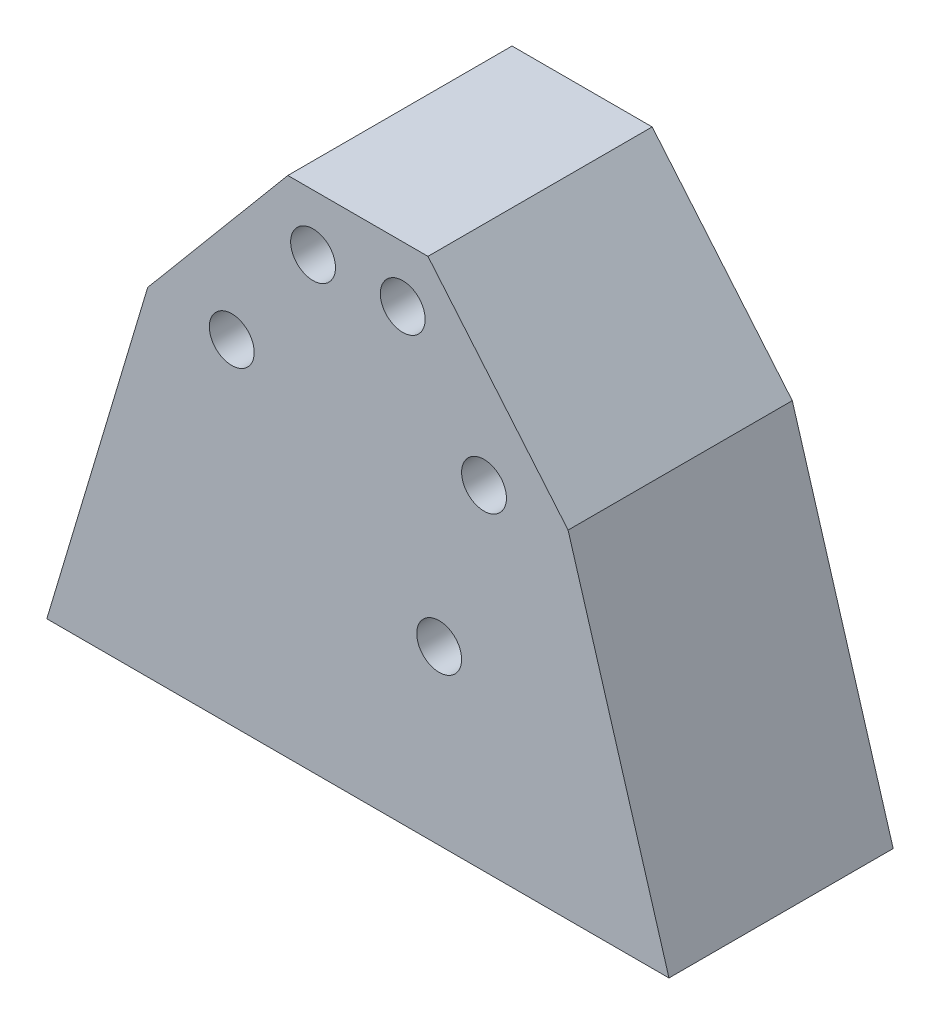
ISO-10303-21;
HEADER;
FILE_DESCRIPTION(('STEP AP214'),'2;1');
FILE_NAME('part.step','',(''),(''),'','','');
FILE_SCHEMA(('AUTOMOTIVE_DESIGN { 1 0 10303 214 1 1 1 1 }'));
ENDSEC;
DATA;
#1=APPLICATION_CONTEXT('core data for automotive mechanical design processes');
#2=APPLICATION_PROTOCOL_DEFINITION('international standard','automotive_design',2000,#1);
#3=PRODUCT_CONTEXT('',#1,'mechanical');
#4=PRODUCT('Part','Part','',(#3));
#5=PRODUCT_RELATED_PRODUCT_CATEGORY('part','',(#4));
#6=PRODUCT_DEFINITION_FORMATION('','',#4);
#7=PRODUCT_DEFINITION_CONTEXT('part definition',#1,'design');
#8=PRODUCT_DEFINITION('design','',#6,#7);
#9=PRODUCT_DEFINITION_SHAPE('','',#8);
#10=(LENGTH_UNIT() NAMED_UNIT(*) SI_UNIT(.MILLI.,.METRE.));
#11=(NAMED_UNIT(*) PLANE_ANGLE_UNIT() SI_UNIT($,.RADIAN.));
#12=(NAMED_UNIT(*) SI_UNIT($,.STERADIAN.) SOLID_ANGLE_UNIT());
#13=UNCERTAINTY_MEASURE_WITH_UNIT(LENGTH_MEASURE(1.E-05),#10,'distance_accuracy_value','');
#14=(GEOMETRIC_REPRESENTATION_CONTEXT(3) GLOBAL_UNCERTAINTY_ASSIGNED_CONTEXT((#13)) GLOBAL_UNIT_ASSIGNED_CONTEXT((#10,
#11,#12)) REPRESENTATION_CONTEXT('',''));
#15=CARTESIAN_POINT('',(0.,0.,0.));
#16=DIRECTION('',(0.,0.,1.));
#17=DIRECTION('',(1.,0.,0.));
#18=AXIS2_PLACEMENT_3D('',#15,#16,#17);
#19=CARTESIAN_POINT('',(0.,45.,40.));
#20=DIRECTION('',(0.,-1.,0.));
#21=DIRECTION('',(0.,0.,-1.));
#22=AXIS2_PLACEMENT_3D('',#19,#20,#21);
#23=PLANE('',#22);
#24=DIRECTION('',(-1.,0.,0.));
#25=VECTOR('',#24,1.);
#26=CARTESIAN_POINT('',(0.,45.,0.));
#27=LINE('',#26,#25);
#28=CARTESIAN_POINT('',(12.5,45.,0.));
#29=VERTEX_POINT('',#28);
#30=CARTESIAN_POINT('',(-12.5,45.,0.));
#31=VERTEX_POINT('',#30);
#32=EDGE_CURVE('E244',#29,#31,#27,.T.);
#33=ORIENTED_EDGE('',*,*,#32,.T.);
#34=DIRECTION('',(0.,0.,-1.));
#35=VECTOR('',#34,1.);
#36=CARTESIAN_POINT('',(-12.5,45.,40.));
#37=LINE('',#36,#35);
#38=CARTESIAN_POINT('',(-12.5,45.,40.));
#39=VERTEX_POINT('',#38);
#40=EDGE_CURVE('E11',#39,#31,#37,.T.);
#41=ORIENTED_EDGE('',*,*,#40,.F.);
#42=DIRECTION('',(-1.,0.,0.));
#43=VECTOR('',#42,1.);
#44=CARTESIAN_POINT('',(0.,45.,40.));
#45=LINE('',#44,#43);
#46=CARTESIAN_POINT('',(12.5,45.,40.));
#47=VERTEX_POINT('',#46);
#48=EDGE_CURVE('E89',#47,#39,#45,.T.);
#49=ORIENTED_EDGE('',*,*,#48,.F.);
#50=DIRECTION('',(0.,0.,-1.));
#51=VECTOR('',#50,1.);
#52=CARTESIAN_POINT('',(12.5,45.,40.));
#53=LINE('',#52,#51);
#54=EDGE_CURVE('E238',#47,#29,#53,.T.);
#55=ORIENTED_EDGE('',*,*,#54,.T.);
#56=EDGE_LOOP('',(#33,#41,#49,#55));
#57=FACE_BOUND('',#56,.T.);
#58=ADVANCED_FACE('F43',(#57),#23,.F.);
#59=CARTESIAN_POINT('',(-29.493475553193,24.7479644588203,40.));
#60=DIRECTION('',(-0.766044443118979,0.642787609686538,0.));
#61=DIRECTION('',(-0.642787609686538,-0.766044443118979,0.));
#62=AXIS2_PLACEMENT_3D('',#59,#60,#61);
#63=PLANE('',#62);
#64=DIRECTION('',(0.642787609686538,0.766044443118979,0.));
#65=VECTOR('',#64,1.);
#66=CARTESIAN_POINT('',(-29.493475553193,24.7479644588203,0.));
#67=LINE('',#66,#65);
#68=CARTESIAN_POINT('',(-37.5,15.2061601851447,0.));
#69=VERTEX_POINT('',#68);
#70=EDGE_CURVE('E139',#69,#31,#67,.T.);
#71=ORIENTED_EDGE('',*,*,#70,.F.);
#72=DIRECTION('',(0.,0.,-1.));
#73=VECTOR('',#72,1.);
#74=CARTESIAN_POINT('',(-37.5,15.2061601851447,40.));
#75=LINE('',#74,#73);
#76=CARTESIAN_POINT('',(-37.5,15.2061601851447,40.));
#77=VERTEX_POINT('',#76);
#78=EDGE_CURVE('E52',#77,#69,#75,.T.);
#79=ORIENTED_EDGE('',*,*,#78,.F.);
#80=DIRECTION('',(0.642787609686538,0.766044443118979,0.));
#81=VECTOR('',#80,1.);
#82=CARTESIAN_POINT('',(-29.493475553193,24.7479644588203,40.));
#83=LINE('',#82,#81);
#84=EDGE_CURVE('E226',#77,#39,#83,.T.);
#85=ORIENTED_EDGE('',*,*,#84,.T.);
#86=ORIENTED_EDGE('',*,*,#40,.T.);
#87=EDGE_LOOP('',(#71,#79,#85,#86));
#88=FACE_BOUND('',#87,.T.);
#89=ADVANCED_FACE('F263',(#88),#63,.T.);
#90=CARTESIAN_POINT('',(0.,-45.,40.));
#91=DIRECTION('',(0.,-1.,0.));
#92=DIRECTION('',(1.,0.,0.));
#93=AXIS2_PLACEMENT_3D('',#90,#91,#92);
#94=PLANE('',#93);
#95=CARTESIAN_POINT('',(-30.,-45.,7.15));
#96=DIRECTION('',(0.,-1.,0.));
#97=DIRECTION('',(1.,0.,0.));
#98=AXIS2_PLACEMENT_3D('',#95,#96,#97);
#99=CIRCLE('',#98,1.75000000000001);
#100=CARTESIAN_POINT('',(-28.25,-45.,7.15));
#101=VERTEX_POINT('',#100);
#102=EDGE_CURVE('E203',#101,#101,#99,.T.);
#103=ORIENTED_EDGE('',*,*,#102,.F.);
#104=EDGE_LOOP('',(#103));
#105=FACE_BOUND('',#104,.T.);
#106=CARTESIAN_POINT('',(-30.,-45.,32.85));
#107=DIRECTION('',(0.,-1.,0.));
#108=DIRECTION('',(-1.,0.,0.));
#109=AXIS2_PLACEMENT_3D('',#106,#107,#108);
#110=CIRCLE('',#109,1.75000000000001);
#111=CARTESIAN_POINT('',(-31.75,-45.,32.85));
#112=VERTEX_POINT('',#111);
#113=EDGE_CURVE('E197',#112,#112,#110,.T.);
#114=ORIENTED_EDGE('',*,*,#113,.F.);
#115=EDGE_LOOP('',(#114));
#116=FACE_BOUND('',#115,.T.);
#117=CARTESIAN_POINT('',(30.,-45.,32.85));
#118=DIRECTION('',(0.,-1.,0.));
#119=DIRECTION('',(1.,0.,0.));
#120=AXIS2_PLACEMENT_3D('',#117,#118,#119);
#121=CIRCLE('',#120,1.75000000000001);
#122=CARTESIAN_POINT('',(31.75,-45.,32.85));
#123=VERTEX_POINT('',#122);
#124=EDGE_CURVE('E190',#123,#123,#121,.T.);
#125=ORIENTED_EDGE('',*,*,#124,.F.);
#126=EDGE_LOOP('',(#125));
#127=FACE_BOUND('',#126,.T.);
#128=CARTESIAN_POINT('',(30.,-45.,7.14999999999997));
#129=DIRECTION('',(0.,-1.,0.));
#130=DIRECTION('',(-1.,0.,0.));
#131=AXIS2_PLACEMENT_3D('',#128,#129,#130);
#132=CIRCLE('',#131,1.75000000000001);
#133=CARTESIAN_POINT('',(28.25,-45.,7.14999999999997));
#134=VERTEX_POINT('',#133);
#135=EDGE_CURVE('E193',#134,#134,#132,.T.);
#136=ORIENTED_EDGE('',*,*,#135,.F.);
#137=EDGE_LOOP('',(#136));
#138=FACE_BOUND('',#137,.T.);
#139=DIRECTION('',(-1.,0.,0.));
#140=VECTOR('',#139,1.);
#141=CARTESIAN_POINT('',(0.,-45.,0.));
#142=LINE('',#141,#140);
#143=CARTESIAN_POINT('',(55.5,-45.,0.));
#144=VERTEX_POINT('',#143);
#145=CARTESIAN_POINT('',(-55.5,-45.,0.));
#146=VERTEX_POINT('',#145);
#147=EDGE_CURVE('E128',#144,#146,#142,.T.);
#148=ORIENTED_EDGE('',*,*,#147,.F.);
#149=DIRECTION('',(0.,0.,1.));
#150=VECTOR('',#149,1.);
#151=CARTESIAN_POINT('',(55.5,-45.,-62.8393326208936));
#152=LINE('',#151,#150);
#153=CARTESIAN_POINT('',(55.5,-45.,40.));
#154=VERTEX_POINT('',#153);
#155=EDGE_CURVE('E132',#144,#154,#152,.T.);
#156=ORIENTED_EDGE('',*,*,#155,.T.);
#157=DIRECTION('',(-1.,0.,0.));
#158=VECTOR('',#157,1.);
#159=CARTESIAN_POINT('',(0.,-45.,40.));
#160=LINE('',#159,#158);
#161=CARTESIAN_POINT('',(-55.5,-45.,40.));
#162=VERTEX_POINT('',#161);
#163=EDGE_CURVE('E229',#154,#162,#160,.T.);
#164=ORIENTED_EDGE('',*,*,#163,.T.);
#165=DIRECTION('',(0.,0.,1.));
#166=VECTOR('',#165,1.);
#167=CARTESIAN_POINT('',(-55.5,-45.,-62.8393326208936));
#168=LINE('',#167,#166);
#169=EDGE_CURVE('E135',#146,#162,#168,.T.);
#170=ORIENTED_EDGE('',*,*,#169,.F.);
#171=EDGE_LOOP('',(#148,#156,#164,#170));
#172=FACE_BOUND('',#171,.T.);
#173=ADVANCED_FACE('F130',(#105,#116,#127,#138,#172),#94,.T.);
#174=CARTESIAN_POINT('',(-22.5,14.6345881455837,40.));
#175=DIRECTION('',(0.,0.,-1.));
#176=DIRECTION('',(-1.,0.,0.));
#177=AXIS2_PLACEMENT_3D('',#174,#175,#176);
#178=CYLINDRICAL_SURFACE('',#177,4.);
#179=CARTESIAN_POINT('',(-22.5,14.6345881455837,40.));
#180=DIRECTION('',(0.,0.,1.));
#181=DIRECTION('',(1.,0.,0.));
#182=AXIS2_PLACEMENT_3D('',#179,#180,#181);
#183=CIRCLE('',#182,4.);
#184=CARTESIAN_POINT('',(-18.5,14.6345881455837,40.));
#185=VERTEX_POINT('',#184);
#186=EDGE_CURVE('E232',#185,#185,#183,.T.);
#187=ORIENTED_EDGE('',*,*,#186,.T.);
#188=EDGE_LOOP('',(#187));
#189=FACE_BOUND('',#188,.T.);
#190=CARTESIAN_POINT('',(-22.5,14.6345881455837,0.));
#191=DIRECTION('',(0.,0.,1.));
#192=DIRECTION('',(1.,0.,0.));
#193=AXIS2_PLACEMENT_3D('',#190,#191,#192);
#194=CIRCLE('',#193,4.);
#195=CARTESIAN_POINT('',(-18.5,14.6345881455837,0.));
#196=VERTEX_POINT('',#195);
#197=EDGE_CURVE('E250',#196,#196,#194,.T.);
#198=ORIENTED_EDGE('',*,*,#197,.F.);
#199=EDGE_LOOP('',(#198));
#200=FACE_BOUND('',#199,.T.);
#201=ADVANCED_FACE('F386',(#189,#200),#178,.F.);
#202=CARTESIAN_POINT('',(29.493475553193,24.7479644588203,40.));
#203=DIRECTION('',(-0.766044443118979,-0.642787609686538,0.));
#204=DIRECTION('',(0.642787609686538,-0.766044443118979,0.));
#205=AXIS2_PLACEMENT_3D('',#202,#203,#204);
#206=PLANE('',#205);
#207=DIRECTION('',(-0.642787609686538,0.766044443118979,0.));
#208=VECTOR('',#207,1.);
#209=CARTESIAN_POINT('',(29.493475553193,24.7479644588203,0.));
#210=LINE('',#209,#208);
#211=CARTESIAN_POINT('',(37.5,15.2061601851447,0.));
#212=VERTEX_POINT('',#211);
#213=EDGE_CURVE('E84',#212,#29,#210,.T.);
#214=ORIENTED_EDGE('',*,*,#213,.T.);
#215=ORIENTED_EDGE('',*,*,#54,.F.);
#216=DIRECTION('',(-0.642787609686538,0.766044443118979,0.));
#217=VECTOR('',#216,1.);
#218=CARTESIAN_POINT('',(29.493475553193,24.7479644588203,40.));
#219=LINE('',#218,#217);
#220=CARTESIAN_POINT('',(37.5,15.2061601851447,40.));
#221=VERTEX_POINT('',#220);
#222=EDGE_CURVE('E68',#221,#47,#219,.T.);
#223=ORIENTED_EDGE('',*,*,#222,.F.);
#224=DIRECTION('',(0.,0.,-1.));
#225=VECTOR('',#224,1.);
#226=CARTESIAN_POINT('',(37.5,15.2061601851447,40.));
#227=LINE('',#226,#225);
#228=EDGE_CURVE('E256',#221,#212,#227,.T.);
#229=ORIENTED_EDGE('',*,*,#228,.T.);
#230=EDGE_LOOP('',(#214,#215,#223,#229));
#231=FACE_BOUND('',#230,.T.);
#232=ADVANCED_FACE('F305',(#231),#206,.F.);
#233=CARTESIAN_POINT('',(22.5,14.6345881455837,40.));
#234=DIRECTION('',(0.,0.,-1.));
#235=DIRECTION('',(-1.,0.,0.));
#236=AXIS2_PLACEMENT_3D('',#233,#234,#235);
#237=CYLINDRICAL_SURFACE('',#236,4.);
#238=CARTESIAN_POINT('',(22.5,14.6345881455837,40.));
#239=DIRECTION('',(0.,0.,1.));
#240=DIRECTION('',(1.,0.,0.));
#241=AXIS2_PLACEMENT_3D('',#238,#239,#240);
#242=CIRCLE('',#241,4.);
#243=CARTESIAN_POINT('',(26.5,14.6345881455837,40.));
#244=VERTEX_POINT('',#243);
#245=EDGE_CURVE('E222',#244,#244,#242,.F.);
#246=ORIENTED_EDGE('',*,*,#245,.F.);
#247=EDGE_LOOP('',(#246));
#248=FACE_BOUND('',#247,.T.);
#249=CARTESIAN_POINT('',(22.5,14.6345881455837,0.));
#250=DIRECTION('',(0.,0.,1.));
#251=DIRECTION('',(1.,0.,0.));
#252=AXIS2_PLACEMENT_3D('',#249,#250,#251);
#253=CIRCLE('',#252,4.);
#254=CARTESIAN_POINT('',(26.5,14.6345881455837,0.));
#255=VERTEX_POINT('',#254);
#256=EDGE_CURVE('E241',#255,#255,#253,.F.);
#257=ORIENTED_EDGE('',*,*,#256,.T.);
#258=EDGE_LOOP('',(#257));
#259=FACE_BOUND('',#258,.T.);
#260=ADVANCED_FACE('F302',(#248,#259),#237,.F.);
#261=CARTESIAN_POINT('',(14.5,-14.2790764440182,40.));
#262=DIRECTION('',(0.,0.,-1.));
#263=DIRECTION('',(-1.,0.,0.));
#264=AXIS2_PLACEMENT_3D('',#261,#262,#263);
#265=CYLINDRICAL_SURFACE('',#264,4.);
#266=CARTESIAN_POINT('',(14.5,-14.2790764440182,30.));
#267=DIRECTION('',(0.,0.,1.));
#268=DIRECTION('',(1.,0.,0.));
#269=AXIS2_PLACEMENT_3D('',#266,#267,#268);
#270=CIRCLE('',#269,4.);
#271=CARTESIAN_POINT('',(18.5,-14.2790764440182,30.));
#272=VERTEX_POINT('',#271);
#273=EDGE_CURVE('E47',#272,#272,#270,.T.);
#274=ORIENTED_EDGE('',*,*,#273,.F.);
#275=EDGE_LOOP('',(#274));
#276=FACE_BOUND('',#275,.T.);
#277=CARTESIAN_POINT('',(14.5,-14.2790764440182,40.));
#278=DIRECTION('',(0.,0.,1.));
#279=DIRECTION('',(1.,0.,0.));
#280=AXIS2_PLACEMENT_3D('',#277,#278,#279);
#281=CIRCLE('',#280,4.);
#282=CARTESIAN_POINT('',(18.5,-14.2790764440182,40.));
#283=VERTEX_POINT('',#282);
#284=EDGE_CURVE('E218',#283,#283,#281,.T.);
#285=ORIENTED_EDGE('',*,*,#284,.T.);
#286=EDGE_LOOP('',(#285));
#287=FACE_BOUND('',#286,.T.);
#288=ADVANCED_FACE('F304',(#276,#287),#265,.F.);
#289=CARTESIAN_POINT('',(7.99999999999999,35.,40.));
#290=DIRECTION('',(0.,0.,-1.));
#291=DIRECTION('',(-1.,0.,0.));
#292=AXIS2_PLACEMENT_3D('',#289,#290,#291);
#293=CYLINDRICAL_SURFACE('',#292,4.00000000000001);
#294=CARTESIAN_POINT('',(7.99999999999999,35.,40.));
#295=DIRECTION('',(0.,0.,1.));
#296=DIRECTION('',(1.,0.,0.));
#297=AXIS2_PLACEMENT_3D('',#294,#295,#296);
#298=CIRCLE('',#297,4.00000000000001);
#299=CARTESIAN_POINT('',(12.,35.,40.));
#300=VERTEX_POINT('',#299);
#301=EDGE_CURVE('E215',#300,#300,#298,.F.);
#302=ORIENTED_EDGE('',*,*,#301,.F.);
#303=EDGE_LOOP('',(#302));
#304=FACE_BOUND('',#303,.T.);
#305=CARTESIAN_POINT('',(7.99999999999999,35.,0.));
#306=DIRECTION('',(0.,0.,1.));
#307=DIRECTION('',(1.,0.,0.));
#308=AXIS2_PLACEMENT_3D('',#305,#306,#307);
#309=CIRCLE('',#308,4.00000000000001);
#310=CARTESIAN_POINT('',(12.,35.,0.));
#311=VERTEX_POINT('',#310);
#312=EDGE_CURVE('E212',#311,#311,#309,.F.);
#313=ORIENTED_EDGE('',*,*,#312,.T.);
#314=EDGE_LOOP('',(#313));
#315=FACE_BOUND('',#314,.T.);
#316=ADVANCED_FACE('F45',(#304,#315),#293,.F.);
#317=CARTESIAN_POINT('',(-8.00000000000002,35.,40.));
#318=DIRECTION('',(0.,0.,-1.));
#319=DIRECTION('',(-1.,0.,0.));
#320=AXIS2_PLACEMENT_3D('',#317,#318,#319);
#321=CYLINDRICAL_SURFACE('',#320,4.00000000000001);
#322=CARTESIAN_POINT('',(-8.00000000000002,35.,40.));
#323=DIRECTION('',(0.,0.,1.));
#324=DIRECTION('',(1.,0.,0.));
#325=AXIS2_PLACEMENT_3D('',#322,#323,#324);
#326=CIRCLE('',#325,4.00000000000001);
#327=CARTESIAN_POINT('',(-4.00000000000001,35.,40.));
#328=VERTEX_POINT('',#327);
#329=EDGE_CURVE('E235',#328,#328,#326,.T.);
#330=ORIENTED_EDGE('',*,*,#329,.T.);
#331=EDGE_LOOP('',(#330));
#332=FACE_BOUND('',#331,.T.);
#333=CARTESIAN_POINT('',(-8.00000000000002,35.,0.));
#334=DIRECTION('',(0.,0.,1.));
#335=DIRECTION('',(1.,0.,0.));
#336=AXIS2_PLACEMENT_3D('',#333,#334,#335);
#337=CIRCLE('',#336,4.00000000000001);
#338=CARTESIAN_POINT('',(-4.00000000000001,35.,0.));
#339=VERTEX_POINT('',#338);
#340=EDGE_CURVE('E219',#339,#339,#337,.T.);
#341=ORIENTED_EDGE('',*,*,#340,.F.);
#342=EDGE_LOOP('',(#341));
#343=FACE_BOUND('',#342,.T.);
#344=ADVANCED_FACE('F267',(#332,#343),#321,.F.);
#345=CARTESIAN_POINT('',(0.,0.,40.));
#346=DIRECTION('',(0.,0.,1.));
#347=DIRECTION('',(1.,0.,0.));
#348=AXIS2_PLACEMENT_3D('',#345,#346,#347);
#349=PLANE('',#348);
#350=ORIENTED_EDGE('',*,*,#301,.T.);
#351=EDGE_LOOP('',(#350));
#352=FACE_BOUND('',#351,.T.);
#353=ORIENTED_EDGE('',*,*,#284,.F.);
#354=EDGE_LOOP('',(#353));
#355=FACE_BOUND('',#354,.T.);
#356=ORIENTED_EDGE('',*,*,#245,.T.);
#357=EDGE_LOOP('',(#356));
#358=FACE_BOUND('',#357,.T.);
#359=ORIENTED_EDGE('',*,*,#48,.T.);
#360=ORIENTED_EDGE('',*,*,#84,.F.);
#361=DIRECTION('',(-0.286444798969987,-0.958096747277144,0.));
#362=VECTOR('',#361,1.);
#363=CARTESIAN_POINT('',(-37.5,15.2061601851447,40.));
#364=LINE('',#363,#362);
#365=EDGE_CURVE('E152',#77,#162,#364,.T.);
#366=ORIENTED_EDGE('',*,*,#365,.T.);
#367=ORIENTED_EDGE('',*,*,#163,.F.);
#368=DIRECTION('',(-0.286444798969987,0.958096747277144,0.));
#369=VECTOR('',#368,1.);
#370=CARTESIAN_POINT('',(37.5,15.2061601851447,40.));
#371=LINE('',#370,#369);
#372=EDGE_CURVE('E150',#154,#221,#371,.T.);
#373=ORIENTED_EDGE('',*,*,#372,.T.);
#374=ORIENTED_EDGE('',*,*,#222,.T.);
#375=EDGE_LOOP('',(#359,#360,#366,#367,#373,#374));
#376=FACE_BOUND('',#375,.T.);
#377=ORIENTED_EDGE('',*,*,#186,.F.);
#378=EDGE_LOOP('',(#377));
#379=FACE_BOUND('',#378,.T.);
#380=ORIENTED_EDGE('',*,*,#329,.F.);
#381=EDGE_LOOP('',(#380));
#382=FACE_BOUND('',#381,.T.);
#383=ADVANCED_FACE('F264',(#352,#355,#358,#376,#379,#382),#349,.T.);
#384=CARTESIAN_POINT('',(0.,0.,0.));
#385=DIRECTION('',(0.,0.,1.));
#386=DIRECTION('',(1.,0.,0.));
#387=AXIS2_PLACEMENT_3D('',#384,#385,#386);
#388=PLANE('',#387);
#389=DIRECTION('',(0.,-1.,0.));
#390=VECTOR('',#389,1.);
#391=CARTESIAN_POINT('',(34.3498039137851,-2.43757472234645,0.));
#392=LINE('',#391,#390);
#393=CARTESIAN_POINT('',(34.3498039137851,-2.43757472234645,0.));
#394=VERTEX_POINT('',#393);
#395=CARTESIAN_POINT('',(34.3498039137851,-25.9970746441076,0.));
#396=VERTEX_POINT('',#395);
#397=EDGE_CURVE('E175',#394,#396,#392,.T.);
#398=ORIENTED_EDGE('',*,*,#397,.F.);
#399=DIRECTION('',(1.,0.,0.));
#400=VECTOR('',#399,1.);
#401=CARTESIAN_POINT('',(34.3498039137851,-2.43757472234645,0.));
#402=LINE('',#401,#400);
#403=CARTESIAN_POINT('',(-25.0494167749597,-2.43757472234645,0.));
#404=VERTEX_POINT('',#403);
#405=EDGE_CURVE('E59',#404,#394,#402,.T.);
#406=ORIENTED_EDGE('',*,*,#405,.F.);
#407=DIRECTION('',(0.,1.,0.));
#408=VECTOR('',#407,1.);
#409=CARTESIAN_POINT('',(-25.0494167749597,-2.43757472234645,0.));
#410=LINE('',#409,#408);
#411=CARTESIAN_POINT('',(-25.0494167749597,-25.9970746441076,0.));
#412=VERTEX_POINT('',#411);
#413=EDGE_CURVE('E164',#412,#404,#410,.T.);
#414=ORIENTED_EDGE('',*,*,#413,.F.);
#415=DIRECTION('',(-1.,0.,0.));
#416=VECTOR('',#415,1.);
#417=CARTESIAN_POINT('',(34.3498039137851,-25.9970746441076,0.));
#418=LINE('',#417,#416);
#419=EDGE_CURVE('E178',#396,#412,#418,.T.);
#420=ORIENTED_EDGE('',*,*,#419,.F.);
#421=EDGE_LOOP('',(#398,#406,#414,#420));
#422=FACE_BOUND('',#421,.T.);
#423=ORIENTED_EDGE('',*,*,#312,.F.);
#424=EDGE_LOOP('',(#423));
#425=FACE_BOUND('',#424,.T.);
#426=ORIENTED_EDGE('',*,*,#256,.F.);
#427=EDGE_LOOP('',(#426));
#428=FACE_BOUND('',#427,.T.);
#429=ORIENTED_EDGE('',*,*,#32,.F.);
#430=ORIENTED_EDGE('',*,*,#213,.F.);
#431=DIRECTION('',(0.286444798969987,-0.958096747277144,0.));
#432=VECTOR('',#431,1.);
#433=CARTESIAN_POINT('',(37.5,15.2061601851447,0.));
#434=LINE('',#433,#432);
#435=EDGE_CURVE('E142',#212,#144,#434,.T.);
#436=ORIENTED_EDGE('',*,*,#435,.T.);
#437=ORIENTED_EDGE('',*,*,#147,.T.);
#438=DIRECTION('',(0.286444798969987,0.958096747277144,0.));
#439=VECTOR('',#438,1.);
#440=CARTESIAN_POINT('',(-37.5,15.2061601851447,0.));
#441=LINE('',#440,#439);
#442=EDGE_CURVE('E158',#146,#69,#441,.T.);
#443=ORIENTED_EDGE('',*,*,#442,.T.);
#444=ORIENTED_EDGE('',*,*,#70,.T.);
#445=EDGE_LOOP('',(#429,#430,#436,#437,#443,#444));
#446=FACE_BOUND('',#445,.T.);
#447=ORIENTED_EDGE('',*,*,#197,.T.);
#448=EDGE_LOOP('',(#447));
#449=FACE_BOUND('',#448,.T.);
#450=ORIENTED_EDGE('',*,*,#340,.T.);
#451=EDGE_LOOP('',(#450));
#452=FACE_BOUND('',#451,.T.);
#453=ADVANCED_FACE('F144',(#422,#425,#428,#446,#449,#452),#388,.F.);
#454=CARTESIAN_POINT('',(30.,-30.,7.14999999999997));
#455=DIRECTION('',(0.,-1.,0.));
#456=DIRECTION('',(1.,0.,0.));
#457=AXIS2_PLACEMENT_3D('',#454,#455,#456);
#458=CYLINDRICAL_SURFACE('',#457,1.75000000000001);
#459=CARTESIAN_POINT('',(30.,-30.,7.14999999999997));
#460=DIRECTION('',(0.,-1.,0.));
#461=DIRECTION('',(-1.,0.,0.));
#462=AXIS2_PLACEMENT_3D('',#459,#460,#461);
#463=CIRCLE('',#462,1.75000000000001);
#464=CARTESIAN_POINT('',(28.25,-30.,7.14999999999997));
#465=VERTEX_POINT('',#464);
#466=EDGE_CURVE('E209',#465,#465,#463,.T.);
#467=ORIENTED_EDGE('',*,*,#466,.F.);
#468=EDGE_LOOP('',(#467));
#469=FACE_BOUND('',#468,.T.);
#470=ORIENTED_EDGE('',*,*,#135,.T.);
#471=EDGE_LOOP('',(#470));
#472=FACE_BOUND('',#471,.T.);
#473=ADVANCED_FACE('F280',(#469,#472),#458,.F.);
#474=CARTESIAN_POINT('',(30.,-30.,7.14999999999997));
#475=DIRECTION('',(0.,1.,0.));
#476=DIRECTION('',(-1.,0.,0.));
#477=AXIS2_PLACEMENT_3D('',#474,#475,#476);
#478=PLANE('',#477);
#479=ORIENTED_EDGE('',*,*,#466,.T.);
#480=EDGE_LOOP('',(#479));
#481=FACE_BOUND('',#480,.T.);
#482=ADVANCED_FACE('F287',(#481),#478,.F.);
#483=CARTESIAN_POINT('',(30.,-30.,32.85));
#484=DIRECTION('',(0.,-1.,0.));
#485=DIRECTION('',(1.,0.,0.));
#486=AXIS2_PLACEMENT_3D('',#483,#484,#485);
#487=CYLINDRICAL_SURFACE('',#486,1.75000000000001);
#488=CARTESIAN_POINT('',(30.,-30.,32.85));
#489=DIRECTION('',(0.,-1.,0.));
#490=DIRECTION('',(1.,0.,0.));
#491=AXIS2_PLACEMENT_3D('',#488,#489,#490);
#492=CIRCLE('',#491,1.75000000000001);
#493=CARTESIAN_POINT('',(31.75,-30.,32.85));
#494=VERTEX_POINT('',#493);
#495=EDGE_CURVE('E194',#494,#494,#492,.T.);
#496=ORIENTED_EDGE('',*,*,#495,.F.);
#497=EDGE_LOOP('',(#496));
#498=FACE_BOUND('',#497,.T.);
#499=ORIENTED_EDGE('',*,*,#124,.T.);
#500=EDGE_LOOP('',(#499));
#501=FACE_BOUND('',#500,.T.);
#502=ADVANCED_FACE('F355',(#498,#501),#487,.F.);
#503=CARTESIAN_POINT('',(30.,-30.,32.85));
#504=DIRECTION('',(0.,-1.,0.));
#505=DIRECTION('',(1.,0.,0.));
#506=AXIS2_PLACEMENT_3D('',#503,#504,#505);
#507=PLANE('',#506);
#508=ORIENTED_EDGE('',*,*,#495,.T.);
#509=EDGE_LOOP('',(#508));
#510=FACE_BOUND('',#509,.T.);
#511=ADVANCED_FACE('F358',(#510),#507,.T.);
#512=CARTESIAN_POINT('',(-30.,-30.,32.85));
#513=DIRECTION('',(0.,-1.,0.));
#514=DIRECTION('',(1.,0.,0.));
#515=AXIS2_PLACEMENT_3D('',#512,#513,#514);
#516=CYLINDRICAL_SURFACE('',#515,1.75000000000001);
#517=CARTESIAN_POINT('',(-30.,-30.,32.85));
#518=DIRECTION('',(0.,-1.,0.));
#519=DIRECTION('',(-1.,0.,0.));
#520=AXIS2_PLACEMENT_3D('',#517,#518,#519);
#521=CIRCLE('',#520,1.75000000000001);
#522=CARTESIAN_POINT('',(-31.75,-30.,32.85));
#523=VERTEX_POINT('',#522);
#524=EDGE_CURVE('E200',#523,#523,#521,.T.);
#525=ORIENTED_EDGE('',*,*,#524,.F.);
#526=EDGE_LOOP('',(#525));
#527=FACE_BOUND('',#526,.T.);
#528=ORIENTED_EDGE('',*,*,#113,.T.);
#529=EDGE_LOOP('',(#528));
#530=FACE_BOUND('',#529,.T.);
#531=ADVANCED_FACE('F362',(#527,#530),#516,.F.);
#532=CARTESIAN_POINT('',(-30.,-30.,32.85));
#533=DIRECTION('',(0.,1.,0.));
#534=DIRECTION('',(-1.,0.,0.));
#535=AXIS2_PLACEMENT_3D('',#532,#533,#534);
#536=PLANE('',#535);
#537=ORIENTED_EDGE('',*,*,#524,.T.);
#538=EDGE_LOOP('',(#537));
#539=FACE_BOUND('',#538,.T.);
#540=ADVANCED_FACE('F366',(#539),#536,.F.);
#541=CARTESIAN_POINT('',(-30.,-30.,7.15));
#542=DIRECTION('',(0.,-1.,0.));
#543=DIRECTION('',(1.,0.,0.));
#544=AXIS2_PLACEMENT_3D('',#541,#542,#543);
#545=CYLINDRICAL_SURFACE('',#544,1.75000000000001);
#546=CARTESIAN_POINT('',(-30.,-30.,7.15));
#547=DIRECTION('',(0.,-1.,0.));
#548=DIRECTION('',(1.,0.,0.));
#549=AXIS2_PLACEMENT_3D('',#546,#547,#548);
#550=CIRCLE('',#549,1.75000000000001);
#551=CARTESIAN_POINT('',(-28.25,-30.,7.15));
#552=VERTEX_POINT('',#551);
#553=EDGE_CURVE('E206',#552,#552,#550,.T.);
#554=ORIENTED_EDGE('',*,*,#553,.F.);
#555=EDGE_LOOP('',(#554));
#556=FACE_BOUND('',#555,.T.);
#557=ORIENTED_EDGE('',*,*,#102,.T.);
#558=EDGE_LOOP('',(#557));
#559=FACE_BOUND('',#558,.T.);
#560=ADVANCED_FACE('F370',(#556,#559),#545,.F.);
#561=CARTESIAN_POINT('',(-30.,-30.,7.15));
#562=DIRECTION('',(0.,-1.,0.));
#563=DIRECTION('',(1.,0.,0.));
#564=AXIS2_PLACEMENT_3D('',#561,#562,#563);
#565=PLANE('',#564);
#566=ORIENTED_EDGE('',*,*,#553,.T.);
#567=EDGE_LOOP('',(#566));
#568=FACE_BOUND('',#567,.T.);
#569=ADVANCED_FACE('F349',(#568),#565,.T.);
#570=CARTESIAN_POINT('',(34.3498039137851,-2.43757472234645,30.));
#571=DIRECTION('',(0.,1.,0.));
#572=DIRECTION('',(0.,0.,1.));
#573=AXIS2_PLACEMENT_3D('',#570,#571,#572);
#574=PLANE('',#573);
#575=ORIENTED_EDGE('',*,*,#405,.T.);
#576=DIRECTION('',(0.,0.,-1.));
#577=VECTOR('',#576,1.);
#578=CARTESIAN_POINT('',(34.3498039137851,-2.43757472234645,30.));
#579=LINE('',#578,#577);
#580=CARTESIAN_POINT('',(34.3498039137851,-2.43757472234645,30.));
#581=VERTEX_POINT('',#580);
#582=EDGE_CURVE('E173',#581,#394,#579,.T.);
#583=ORIENTED_EDGE('',*,*,#582,.F.);
#584=DIRECTION('',(1.,0.,0.));
#585=VECTOR('',#584,1.);
#586=CARTESIAN_POINT('',(34.3498039137851,-2.43757472234645,30.));
#587=LINE('',#586,#585);
#588=CARTESIAN_POINT('',(-25.0494167749597,-2.43757472234645,30.));
#589=VERTEX_POINT('',#588);
#590=EDGE_CURVE('E160',#589,#581,#587,.T.);
#591=ORIENTED_EDGE('',*,*,#590,.F.);
#592=DIRECTION('',(0.,0.,-1.));
#593=VECTOR('',#592,1.);
#594=CARTESIAN_POINT('',(-25.0494167749597,-2.43757472234645,30.));
#595=LINE('',#594,#593);
#596=EDGE_CURVE('E183',#589,#404,#595,.T.);
#597=ORIENTED_EDGE('',*,*,#596,.T.);
#598=EDGE_LOOP('',(#575,#583,#591,#597));
#599=FACE_BOUND('',#598,.T.);
#600=ADVANCED_FACE('F334',(#599),#574,.F.);
#601=CARTESIAN_POINT('',(-25.0494167749597,-2.43757472234645,30.));
#602=DIRECTION('',(-1.,0.,0.));
#603=DIRECTION('',(0.,0.,1.));
#604=AXIS2_PLACEMENT_3D('',#601,#602,#603);
#605=PLANE('',#604);
#606=ORIENTED_EDGE('',*,*,#413,.T.);
#607=ORIENTED_EDGE('',*,*,#596,.F.);
#608=DIRECTION('',(0.,1.,0.));
#609=VECTOR('',#608,1.);
#610=CARTESIAN_POINT('',(-25.0494167749597,-2.43757472234645,30.));
#611=LINE('',#610,#609);
#612=CARTESIAN_POINT('',(-25.0494167749597,-25.9970746441076,30.));
#613=VERTEX_POINT('',#612);
#614=EDGE_CURVE('E170',#613,#589,#611,.T.);
#615=ORIENTED_EDGE('',*,*,#614,.F.);
#616=DIRECTION('',(0.,0.,-1.));
#617=VECTOR('',#616,1.);
#618=CARTESIAN_POINT('',(-25.0494167749597,-25.9970746441076,30.));
#619=LINE('',#618,#617);
#620=EDGE_CURVE('E185',#613,#412,#619,.T.);
#621=ORIENTED_EDGE('',*,*,#620,.T.);
#622=EDGE_LOOP('',(#606,#607,#615,#621));
#623=FACE_BOUND('',#622,.T.);
#624=ADVANCED_FACE('F341',(#623),#605,.F.);
#625=CARTESIAN_POINT('',(34.3498039137851,-25.9970746441076,30.));
#626=DIRECTION('',(0.,-1.,0.));
#627=DIRECTION('',(0.,0.,-1.));
#628=AXIS2_PLACEMENT_3D('',#625,#626,#627);
#629=PLANE('',#628);
#630=ORIENTED_EDGE('',*,*,#419,.T.);
#631=ORIENTED_EDGE('',*,*,#620,.F.);
#632=DIRECTION('',(-1.,0.,0.));
#633=VECTOR('',#632,1.);
#634=CARTESIAN_POINT('',(34.3498039137851,-25.9970746441076,30.));
#635=LINE('',#634,#633);
#636=CARTESIAN_POINT('',(34.3498039137851,-25.9970746441076,30.));
#637=VERTEX_POINT('',#636);
#638=EDGE_CURVE('E167',#637,#613,#635,.T.);
#639=ORIENTED_EDGE('',*,*,#638,.F.);
#640=DIRECTION('',(0.,0.,-1.));
#641=VECTOR('',#640,1.);
#642=CARTESIAN_POINT('',(34.3498039137851,-25.9970746441076,30.));
#643=LINE('',#642,#641);
#644=EDGE_CURVE('E187',#637,#396,#643,.T.);
#645=ORIENTED_EDGE('',*,*,#644,.T.);
#646=EDGE_LOOP('',(#630,#631,#639,#645));
#647=FACE_BOUND('',#646,.T.);
#648=ADVANCED_FACE('F339',(#647),#629,.F.);
#649=CARTESIAN_POINT('',(34.3498039137851,-2.43757472234645,30.));
#650=DIRECTION('',(1.,0.,0.));
#651=DIRECTION('',(0.,0.,-1.));
#652=AXIS2_PLACEMENT_3D('',#649,#650,#651);
#653=PLANE('',#652);
#654=ORIENTED_EDGE('',*,*,#397,.T.);
#655=ORIENTED_EDGE('',*,*,#644,.F.);
#656=DIRECTION('',(0.,-1.,0.));
#657=VECTOR('',#656,1.);
#658=CARTESIAN_POINT('',(34.3498039137851,-2.43757472234645,30.));
#659=LINE('',#658,#657);
#660=EDGE_CURVE('E163',#581,#637,#659,.T.);
#661=ORIENTED_EDGE('',*,*,#660,.F.);
#662=ORIENTED_EDGE('',*,*,#582,.T.);
#663=EDGE_LOOP('',(#654,#655,#661,#662));
#664=FACE_BOUND('',#663,.T.);
#665=ADVANCED_FACE('F329',(#664),#653,.F.);
#666=CARTESIAN_POINT('',(0.,0.,30.));
#667=DIRECTION('',(0.,0.,1.));
#668=DIRECTION('',(1.,0.,0.));
#669=AXIS2_PLACEMENT_3D('',#666,#667,#668);
#670=PLANE('',#669);
#671=ORIENTED_EDGE('',*,*,#273,.T.);
#672=EDGE_LOOP('',(#671));
#673=FACE_BOUND('',#672,.T.);
#674=ORIENTED_EDGE('',*,*,#590,.T.);
#675=ORIENTED_EDGE('',*,*,#660,.T.);
#676=ORIENTED_EDGE('',*,*,#638,.T.);
#677=ORIENTED_EDGE('',*,*,#614,.T.);
#678=EDGE_LOOP('',(#674,#675,#676,#677));
#679=FACE_BOUND('',#678,.T.);
#680=ADVANCED_FACE('F326',(#673,#679),#670,.F.);
#681=CARTESIAN_POINT('',(-37.5,15.2061601851447,-62.8393326208936));
#682=DIRECTION('',(-0.958096747277144,0.286444798969987,0.));
#683=DIRECTION('',(-0.286444798969987,-0.958096747277144,0.));
#684=AXIS2_PLACEMENT_3D('',#681,#682,#683);
#685=PLANE('',#684);
#686=ORIENTED_EDGE('',*,*,#442,.F.);
#687=ORIENTED_EDGE('',*,*,#169,.T.);
#688=ORIENTED_EDGE('',*,*,#365,.F.);
#689=ORIENTED_EDGE('',*,*,#78,.T.);
#690=EDGE_LOOP('',(#686,#687,#688,#689));
#691=FACE_BOUND('',#690,.T.);
#692=ADVANCED_FACE('F261',(#691),#685,.T.);
#693=CARTESIAN_POINT('',(37.5,15.2061601851447,-62.8393326208936));
#694=DIRECTION('',(0.958096747277144,0.286444798969987,0.));
#695=DIRECTION('',(-0.286444798969987,0.958096747277144,0.));
#696=AXIS2_PLACEMENT_3D('',#693,#694,#695);
#697=PLANE('',#696);
#698=ORIENTED_EDGE('',*,*,#435,.F.);
#699=ORIENTED_EDGE('',*,*,#228,.F.);
#700=ORIENTED_EDGE('',*,*,#372,.F.);
#701=ORIENTED_EDGE('',*,*,#155,.F.);
#702=EDGE_LOOP('',(#698,#699,#700,#701));
#703=FACE_BOUND('',#702,.T.);
#704=ADVANCED_FACE('F149',(#703),#697,.T.);
#705=CLOSED_SHELL('',(#58,#89,#173,#201,#232,#260,#288,#316,#344,#383,#453,#473,#482,#502,#511,
#531,#540,#560,#569,#600,#624,#648,#665,#680,#692,#704));
#706=MANIFOLD_SOLID_BREP('B2',#705);
#707=ADVANCED_BREP_SHAPE_REPRESENTATION('',(#18,#706),#14);
#708=SHAPE_DEFINITION_REPRESENTATION(#9,#707);
ENDSEC;
END-ISO-10303-21;
